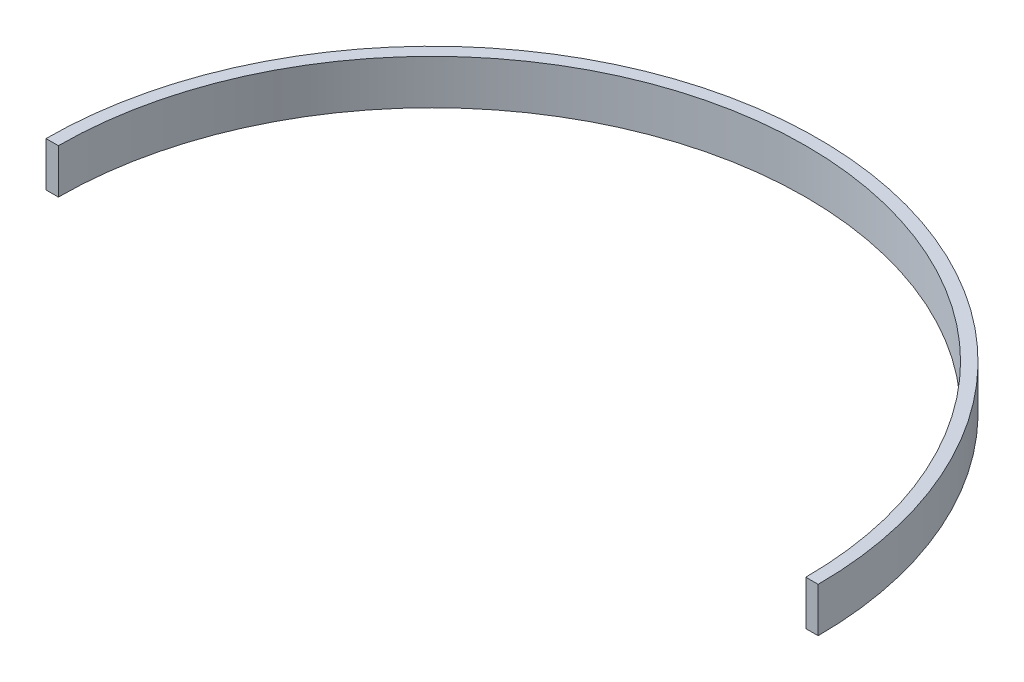
ISO-10303-21;
HEADER;
FILE_DESCRIPTION(('STEP AP214'),'2;1');
FILE_NAME('part.step','',(''),(''),'','','');
FILE_SCHEMA(('AUTOMOTIVE_DESIGN { 1 0 10303 214 1 1 1 1 }'));
ENDSEC;
DATA;
#1=APPLICATION_CONTEXT('core data for automotive mechanical design processes');
#2=APPLICATION_PROTOCOL_DEFINITION('international standard','automotive_design',2000,#1);
#3=PRODUCT_CONTEXT('',#1,'mechanical');
#4=PRODUCT('Part','Part','',(#3));
#5=PRODUCT_RELATED_PRODUCT_CATEGORY('part','',(#4));
#6=PRODUCT_DEFINITION_FORMATION('','',#4);
#7=PRODUCT_DEFINITION_CONTEXT('part definition',#1,'design');
#8=PRODUCT_DEFINITION('design','',#6,#7);
#9=PRODUCT_DEFINITION_SHAPE('','',#8);
#10=(LENGTH_UNIT() NAMED_UNIT(*) SI_UNIT(.MILLI.,.METRE.));
#11=(NAMED_UNIT(*) PLANE_ANGLE_UNIT() SI_UNIT($,.RADIAN.));
#12=(NAMED_UNIT(*) SI_UNIT($,.STERADIAN.) SOLID_ANGLE_UNIT());
#13=UNCERTAINTY_MEASURE_WITH_UNIT(LENGTH_MEASURE(1.E-05),#10,'distance_accuracy_value','');
#14=(GEOMETRIC_REPRESENTATION_CONTEXT(3) GLOBAL_UNCERTAINTY_ASSIGNED_CONTEXT((#13)) GLOBAL_UNIT_ASSIGNED_CONTEXT((#10,
#11,#12)) REPRESENTATION_CONTEXT('',''));
#15=CARTESIAN_POINT('',(0.,0.,0.));
#16=DIRECTION('',(0.,0.,1.));
#17=DIRECTION('',(1.,0.,0.));
#18=AXIS2_PLACEMENT_3D('',#15,#16,#17);
#19=CARTESIAN_POINT('',(0.,4.5,0.));
#20=DIRECTION('',(0.,-1.,0.));
#21=DIRECTION('',(0.,0.,-1.));
#22=AXIS2_PLACEMENT_3D('',#19,#20,#21);
#23=CYLINDRICAL_SURFACE('',#22,78.);
#24=CARTESIAN_POINT('',(0.,-4.5,0.));
#25=DIRECTION('',(0.,1.,0.));
#26=DIRECTION('',(0.,0.,1.));
#27=AXIS2_PLACEMENT_3D('',#24,#25,#26);
#28=CIRCLE('',#27,78.);
#29=CARTESIAN_POINT('',(78.,-4.5,2.91433543964104E-13));
#30=VERTEX_POINT('',#29);
#31=CARTESIAN_POINT('',(-78.,-4.5,2.70616862252382E-13));
#32=VERTEX_POINT('',#31);
#33=EDGE_CURVE('E96',#30,#32,#28,.T.);
#34=ORIENTED_EDGE('',*,*,#33,.T.);
#35=DIRECTION('',(0.,-1.,0.));
#36=VECTOR('',#35,1.);
#37=CARTESIAN_POINT('',(-78.,4.5,2.70616862252382E-13));
#38=LINE('',#37,#36);
#39=CARTESIAN_POINT('',(-78.,4.5,2.70616862252382E-13));
#40=VERTEX_POINT('',#39);
#41=EDGE_CURVE('E11',#40,#32,#38,.T.);
#42=ORIENTED_EDGE('',*,*,#41,.F.);
#43=CARTESIAN_POINT('',(0.,4.5,0.));
#44=DIRECTION('',(0.,1.,0.));
#45=DIRECTION('',(0.,0.,1.));
#46=AXIS2_PLACEMENT_3D('',#43,#44,#45);
#47=CIRCLE('',#46,78.);
#48=CARTESIAN_POINT('',(78.,4.5,2.91433543964104E-13));
#49=VERTEX_POINT('',#48);
#50=EDGE_CURVE('E84',#49,#40,#47,.T.);
#51=ORIENTED_EDGE('',*,*,#50,.F.);
#52=DIRECTION('',(0.,-1.,0.));
#53=VECTOR('',#52,1.);
#54=CARTESIAN_POINT('',(78.,4.5,2.91433543964104E-13));
#55=LINE('',#54,#53);
#56=EDGE_CURVE('E92',#49,#30,#55,.T.);
#57=ORIENTED_EDGE('',*,*,#56,.T.);
#58=EDGE_LOOP('',(#34,#42,#51,#57));
#59=FACE_BOUND('',#58,.T.);
#60=ADVANCED_FACE('F33',(#59),#23,.T.);
#61=CARTESIAN_POINT('',(-75.5,4.5,2.84494650060196E-13));
#62=DIRECTION('',(0.,0.,-1.));
#63=DIRECTION('',(-1.,0.,0.));
#64=AXIS2_PLACEMENT_3D('',#61,#62,#63);
#65=PLANE('',#64);
#66=DIRECTION('',(1.,0.,0.));
#67=VECTOR('',#66,1.);
#68=CARTESIAN_POINT('',(-75.5,-4.5,2.84494650060196E-13));
#69=LINE('',#68,#67);
#70=CARTESIAN_POINT('',(-75.5,-4.5,2.54360757749094E-13));
#71=VERTEX_POINT('',#70);
#72=EDGE_CURVE('E88',#32,#71,#69,.T.);
#73=ORIENTED_EDGE('',*,*,#72,.T.);
#74=DIRECTION('',(0.,-1.,0.));
#75=VECTOR('',#74,1.);
#76=CARTESIAN_POINT('',(-75.5,4.5,2.54360757749094E-13));
#77=LINE('',#76,#75);
#78=CARTESIAN_POINT('',(-75.5,4.5,2.54360757749094E-13));
#79=VERTEX_POINT('',#78);
#80=EDGE_CURVE('E41',#79,#71,#77,.T.);
#81=ORIENTED_EDGE('',*,*,#80,.F.);
#82=DIRECTION('',(1.,0.,0.));
#83=VECTOR('',#82,1.);
#84=CARTESIAN_POINT('',(-75.5,4.5,2.84494650060196E-13));
#85=LINE('',#84,#83);
#86=EDGE_CURVE('E79',#40,#79,#85,.T.);
#87=ORIENTED_EDGE('',*,*,#86,.F.);
#88=ORIENTED_EDGE('',*,*,#41,.T.);
#89=EDGE_LOOP('',(#73,#81,#87,#88));
#90=FACE_BOUND('',#89,.T.);
#91=ADVANCED_FACE('F87',(#90),#65,.F.);
#92=CARTESIAN_POINT('',(0.,4.5,0.));
#93=DIRECTION('',(0.,-1.,0.));
#94=DIRECTION('',(0.,0.,-1.));
#95=AXIS2_PLACEMENT_3D('',#92,#93,#94);
#96=CYLINDRICAL_SURFACE('',#95,75.5);
#97=CARTESIAN_POINT('',(0.,-4.5,0.));
#98=DIRECTION('',(0.,-1.,0.));
#99=DIRECTION('',(0.,0.,1.));
#100=AXIS2_PLACEMENT_3D('',#97,#98,#99);
#101=CIRCLE('',#100,75.5);
#102=CARTESIAN_POINT('',(75.5,-4.5,2.84494650060196E-13));
#103=VERTEX_POINT('',#102);
#104=EDGE_CURVE('E66',#71,#103,#101,.T.);
#105=ORIENTED_EDGE('',*,*,#104,.T.);
#106=DIRECTION('',(0.,-1.,0.));
#107=VECTOR('',#106,1.);
#108=CARTESIAN_POINT('',(75.5,4.5,2.84494650060196E-13));
#109=LINE('',#108,#107);
#110=CARTESIAN_POINT('',(75.5,4.5,2.84494650060196E-13));
#111=VERTEX_POINT('',#110);
#112=EDGE_CURVE('E89',#111,#103,#109,.T.);
#113=ORIENTED_EDGE('',*,*,#112,.F.);
#114=CARTESIAN_POINT('',(0.,4.5,0.));
#115=DIRECTION('',(0.,-1.,0.));
#116=DIRECTION('',(0.,0.,1.));
#117=AXIS2_PLACEMENT_3D('',#114,#115,#116);
#118=CIRCLE('',#117,75.5);
#119=EDGE_CURVE('E82',#79,#111,#118,.T.);
#120=ORIENTED_EDGE('',*,*,#119,.F.);
#121=ORIENTED_EDGE('',*,*,#80,.T.);
#122=EDGE_LOOP('',(#105,#113,#120,#121));
#123=FACE_BOUND('',#122,.T.);
#124=ADVANCED_FACE('F90',(#123),#96,.F.);
#125=CARTESIAN_POINT('',(75.5,4.5,2.84494650060196E-13));
#126=DIRECTION('',(0.,0.,-1.));
#127=DIRECTION('',(-1.,0.,0.));
#128=AXIS2_PLACEMENT_3D('',#125,#126,#127);
#129=PLANE('',#128);
#130=DIRECTION('',(1.,0.,0.));
#131=VECTOR('',#130,1.);
#132=CARTESIAN_POINT('',(75.5,-4.5,2.84494650060196E-13));
#133=LINE('',#132,#131);
#134=EDGE_CURVE('E72',#103,#30,#133,.T.);
#135=ORIENTED_EDGE('',*,*,#134,.T.);
#136=ORIENTED_EDGE('',*,*,#56,.F.);
#137=DIRECTION('',(1.,0.,0.));
#138=VECTOR('',#137,1.);
#139=CARTESIAN_POINT('',(75.5,4.5,2.84494650060196E-13));
#140=LINE('',#139,#138);
#141=EDGE_CURVE('E49',#111,#49,#140,.T.);
#142=ORIENTED_EDGE('',*,*,#141,.F.);
#143=ORIENTED_EDGE('',*,*,#112,.T.);
#144=EDGE_LOOP('',(#135,#136,#142,#143));
#145=FACE_BOUND('',#144,.T.);
#146=ADVANCED_FACE('F103',(#145),#129,.F.);
#147=CARTESIAN_POINT('',(0.,4.5,0.));
#148=DIRECTION('',(0.,1.,0.));
#149=DIRECTION('',(0.,0.,1.));
#150=AXIS2_PLACEMENT_3D('',#147,#148,#149);
#151=PLANE('',#150);
#152=ORIENTED_EDGE('',*,*,#50,.T.);
#153=ORIENTED_EDGE('',*,*,#86,.T.);
#154=ORIENTED_EDGE('',*,*,#119,.T.);
#155=ORIENTED_EDGE('',*,*,#141,.T.);
#156=EDGE_LOOP('',(#152,#153,#154,#155));
#157=FACE_BOUND('',#156,.T.);
#158=ADVANCED_FACE('F80',(#157),#151,.T.);
#159=CARTESIAN_POINT('',(0.,-4.5,0.));
#160=DIRECTION('',(0.,1.,0.));
#161=DIRECTION('',(0.,0.,1.));
#162=AXIS2_PLACEMENT_3D('',#159,#160,#161);
#163=PLANE('',#162);
#164=ORIENTED_EDGE('',*,*,#33,.F.);
#165=ORIENTED_EDGE('',*,*,#134,.F.);
#166=ORIENTED_EDGE('',*,*,#104,.F.);
#167=ORIENTED_EDGE('',*,*,#72,.F.);
#168=EDGE_LOOP('',(#164,#165,#166,#167));
#169=FACE_BOUND('',#168,.T.);
#170=ADVANCED_FACE('F106',(#169),#163,.F.);
#171=CLOSED_SHELL('',(#60,#91,#124,#146,#158,#170));
#172=MANIFOLD_SOLID_BREP('B2',#171);
#173=ADVANCED_BREP_SHAPE_REPRESENTATION('',(#18,#172),#14);
#174=SHAPE_DEFINITION_REPRESENTATION(#9,#173);
ENDSEC;
END-ISO-10303-21;
